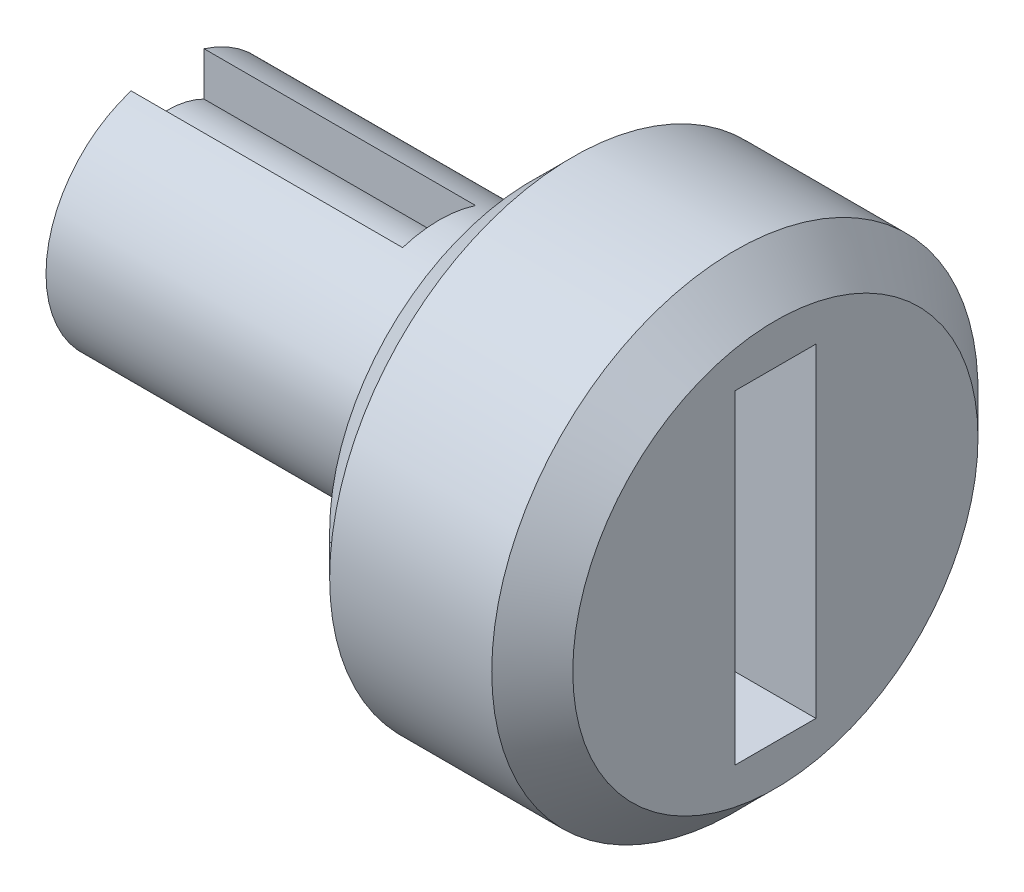
ISO-10303-21;
HEADER;
FILE_DESCRIPTION(('STEP AP214'),'2;1');
FILE_NAME('part.step','',(''),(''),'','','');
FILE_SCHEMA(('AUTOMOTIVE_DESIGN { 1 0 10303 214 1 1 1 1 }'));
ENDSEC;
DATA;
#1=APPLICATION_CONTEXT('core data for automotive mechanical design processes');
#2=APPLICATION_PROTOCOL_DEFINITION('international standard','automotive_design',2000,#1);
#3=PRODUCT_CONTEXT('',#1,'mechanical');
#4=PRODUCT('Part','Part','',(#3));
#5=PRODUCT_RELATED_PRODUCT_CATEGORY('part','',(#4));
#6=PRODUCT_DEFINITION_FORMATION('','',#4);
#7=PRODUCT_DEFINITION_CONTEXT('part definition',#1,'design');
#8=PRODUCT_DEFINITION('design','',#6,#7);
#9=PRODUCT_DEFINITION_SHAPE('','',#8);
#10=(LENGTH_UNIT() NAMED_UNIT(*) SI_UNIT(.MILLI.,.METRE.));
#11=(NAMED_UNIT(*) PLANE_ANGLE_UNIT() SI_UNIT($,.RADIAN.));
#12=(NAMED_UNIT(*) SI_UNIT($,.STERADIAN.) SOLID_ANGLE_UNIT());
#13=UNCERTAINTY_MEASURE_WITH_UNIT(LENGTH_MEASURE(1.E-05),#10,'distance_accuracy_value','');
#14=(GEOMETRIC_REPRESENTATION_CONTEXT(3) GLOBAL_UNCERTAINTY_ASSIGNED_CONTEXT((#13)) GLOBAL_UNIT_ASSIGNED_CONTEXT((#10,
#11,#12)) REPRESENTATION_CONTEXT('',''));
#15=CARTESIAN_POINT('',(0.,0.,0.));
#16=DIRECTION('',(0.,0.,1.));
#17=DIRECTION('',(1.,0.,0.));
#18=AXIS2_PLACEMENT_3D('',#15,#16,#17);
#19=CARTESIAN_POINT('',(0.,0.,0.));
#20=DIRECTION('',(1.,0.,0.));
#21=DIRECTION('',(0.,0.,-1.));
#22=AXIS2_PLACEMENT_3D('',#19,#20,#21);
#23=PLANE('',#22);
#24=CARTESIAN_POINT('',(0.,0.,0.));
#25=DIRECTION('',(-1.,0.,0.));
#26=DIRECTION('',(0.,0.,1.));
#27=AXIS2_PLACEMENT_3D('',#24,#25,#26);
#28=CIRCLE('',#27,1.);
#29=CARTESIAN_POINT('',(0.,0.,1.));
#30=VERTEX_POINT('',#29);
#31=EDGE_CURVE('E216',#30,#30,#28,.T.);
#32=ORIENTED_EDGE('',*,*,#31,.F.);
#33=EDGE_LOOP('',(#32));
#34=FACE_BOUND('',#33,.T.);
#35=CARTESIAN_POINT('',(0.,0.,0.));
#36=DIRECTION('',(1.,0.,0.));
#37=DIRECTION('',(0.,0.,1.));
#38=AXIS2_PLACEMENT_3D('',#35,#36,#37);
#39=CIRCLE('',#38,2.);
#40=CARTESIAN_POINT('',(0.,-1.78605710994917,0.9));
#41=VERTEX_POINT('',#40);
#42=CARTESIAN_POINT('',(0.,-1.78605710994917,-0.9));
#43=VERTEX_POINT('',#42);
#44=EDGE_CURVE('E148',#41,#43,#39,.T.);
#45=ORIENTED_EDGE('',*,*,#44,.F.);
#46=DIRECTION('',(0.,1.,0.));
#47=VECTOR('',#46,1.);
#48=CARTESIAN_POINT('',(0.,-1.78605710994917,0.9));
#49=LINE('',#48,#47);
#50=CARTESIAN_POINT('',(0.,-2.86181760425084,0.9));
#51=VERTEX_POINT('',#50);
#52=EDGE_CURVE('E140',#51,#41,#49,.T.);
#53=ORIENTED_EDGE('',*,*,#52,.F.);
#54=CARTESIAN_POINT('',(0.,0.,0.));
#55=DIRECTION('',(-1.,0.,0.));
#56=DIRECTION('',(0.,0.,1.));
#57=AXIS2_PLACEMENT_3D('',#54,#55,#56);
#58=CIRCLE('',#57,3.);
#59=CARTESIAN_POINT('',(0.,2.86181760425084,0.9));
#60=VERTEX_POINT('',#59);
#61=EDGE_CURVE('E57',#51,#60,#58,.T.);
#62=ORIENTED_EDGE('',*,*,#61,.T.);
#63=DIRECTION('',(0.,1.,0.));
#64=VECTOR('',#63,1.);
#65=CARTESIAN_POINT('',(0.,2.86181760425084,0.9));
#66=LINE('',#65,#64);
#67=CARTESIAN_POINT('',(0.,1.78605710994917,0.9));
#68=VERTEX_POINT('',#67);
#69=EDGE_CURVE('E162',#68,#60,#66,.T.);
#70=ORIENTED_EDGE('',*,*,#69,.F.);
#71=CARTESIAN_POINT('',(0.,0.,0.));
#72=DIRECTION('',(1.,0.,0.));
#73=DIRECTION('',(0.,0.,1.));
#74=AXIS2_PLACEMENT_3D('',#71,#72,#73);
#75=CIRCLE('',#74,2.);
#76=CARTESIAN_POINT('',(0.,1.78605710994917,-0.9));
#77=VERTEX_POINT('',#76);
#78=EDGE_CURVE('E165',#77,#68,#75,.T.);
#79=ORIENTED_EDGE('',*,*,#78,.F.);
#80=DIRECTION('',(0.,-1.,0.));
#81=VECTOR('',#80,1.);
#82=CARTESIAN_POINT('',(0.,2.86181760425084,-0.9));
#83=LINE('',#82,#81);
#84=CARTESIAN_POINT('',(0.,2.86181760425084,-0.9));
#85=VERTEX_POINT('',#84);
#86=EDGE_CURVE('E161',#85,#77,#83,.T.);
#87=ORIENTED_EDGE('',*,*,#86,.F.);
#88=CARTESIAN_POINT('',(0.,-2.86181760425084,-0.9));
#89=VERTEX_POINT('',#88);
#90=EDGE_CURVE('E231',#85,#89,#58,.T.);
#91=ORIENTED_EDGE('',*,*,#90,.T.);
#92=DIRECTION('',(0.,-1.,0.));
#93=VECTOR('',#92,1.);
#94=CARTESIAN_POINT('',(0.,-1.78605710994917,-0.9));
#95=LINE('',#94,#93);
#96=EDGE_CURVE('E49',#43,#89,#95,.T.);
#97=ORIENTED_EDGE('',*,*,#96,.F.);
#98=EDGE_LOOP('',(#45,#53,#62,#70,#79,#87,#91,#97));
#99=FACE_BOUND('',#98,.T.);
#100=ADVANCED_FACE('F34',(#34,#99),#23,.F.);
#101=CARTESIAN_POINT('',(0.,0.,0.));
#102=DIRECTION('',(-1.,0.,0.));
#103=DIRECTION('',(0.,0.,1.));
#104=AXIS2_PLACEMENT_3D('',#101,#102,#103);
#105=CYLINDRICAL_SURFACE('',#104,3.);
#106=ORIENTED_EDGE('',*,*,#61,.F.);
#107=DIRECTION('',(-1.,0.,0.));
#108=VECTOR('',#107,1.);
#109=CARTESIAN_POINT('',(11.171095884641,-2.86181760425084,0.9));
#110=LINE('',#109,#108);
#111=CARTESIAN_POINT('',(6.7,-2.86181760425084,0.9));
#112=VERTEX_POINT('',#111);
#113=EDGE_CURVE('E154',#112,#51,#110,.T.);
#114=ORIENTED_EDGE('',*,*,#113,.F.);
#115=CARTESIAN_POINT('',(6.7,0.,0.));
#116=DIRECTION('',(1.,0.,0.));
#117=DIRECTION('',(0.,0.,-1.));
#118=AXIS2_PLACEMENT_3D('',#115,#116,#117);
#119=CIRCLE('',#118,3.);
#120=CARTESIAN_POINT('',(6.7,-2.86181760425084,-0.9));
#121=VERTEX_POINT('',#120);
#122=EDGE_CURVE('E145',#121,#112,#119,.F.);
#123=ORIENTED_EDGE('',*,*,#122,.F.);
#124=DIRECTION('',(-1.,0.,0.));
#125=VECTOR('',#124,1.);
#126=CARTESIAN_POINT('',(11.171095884641,-2.86181760425084,-0.9));
#127=LINE('',#126,#125);
#128=EDGE_CURVE('E155',#121,#89,#127,.T.);
#129=ORIENTED_EDGE('',*,*,#128,.T.);
#130=ORIENTED_EDGE('',*,*,#90,.F.);
#131=DIRECTION('',(-1.,0.,0.));
#132=VECTOR('',#131,1.);
#133=CARTESIAN_POINT('',(11.171095884641,2.86181760425084,-0.9));
#134=LINE('',#133,#132);
#135=CARTESIAN_POINT('',(6.7,2.86181760425084,-0.9));
#136=VERTEX_POINT('',#135);
#137=EDGE_CURVE('E176',#136,#85,#134,.T.);
#138=ORIENTED_EDGE('',*,*,#137,.F.);
#139=CARTESIAN_POINT('',(6.7,0.,0.));
#140=DIRECTION('',(1.,0.,0.));
#141=DIRECTION('',(0.,0.,-1.));
#142=AXIS2_PLACEMENT_3D('',#139,#140,#141);
#143=CIRCLE('',#142,3.);
#144=CARTESIAN_POINT('',(6.7,2.86181760425084,0.9));
#145=VERTEX_POINT('',#144);
#146=EDGE_CURVE('E173',#145,#136,#143,.F.);
#147=ORIENTED_EDGE('',*,*,#146,.F.);
#148=DIRECTION('',(-1.,0.,0.));
#149=VECTOR('',#148,1.);
#150=CARTESIAN_POINT('',(11.171095884641,2.86181760425084,0.9));
#151=LINE('',#150,#149);
#152=EDGE_CURVE('E177',#145,#60,#151,.T.);
#153=ORIENTED_EDGE('',*,*,#152,.T.);
#154=EDGE_LOOP('',(#106,#114,#123,#129,#130,#138,#147,#153));
#155=FACE_BOUND('',#154,.T.);
#156=CARTESIAN_POINT('',(9.,0.,0.));
#157=DIRECTION('',(-1.,0.,0.));
#158=DIRECTION('',(0.,0.,1.));
#159=AXIS2_PLACEMENT_3D('',#156,#157,#158);
#160=CIRCLE('',#159,3.);
#161=CARTESIAN_POINT('',(9.,0.,3.));
#162=VERTEX_POINT('',#161);
#163=EDGE_CURVE('E228',#162,#162,#160,.T.);
#164=ORIENTED_EDGE('',*,*,#163,.T.);
#165=EDGE_LOOP('',(#164));
#166=FACE_BOUND('',#165,.T.);
#167=ADVANCED_FACE('F265',(#155,#166),#105,.T.);
#168=CARTESIAN_POINT('',(9.,0.,-3.));
#169=DIRECTION('',(1.,0.,0.));
#170=DIRECTION('',(0.,0.,-1.));
#171=AXIS2_PLACEMENT_3D('',#168,#169,#170);
#172=PLANE('',#171);
#173=CARTESIAN_POINT('',(9.,0.,0.));
#174=DIRECTION('',(1.,0.,0.));
#175=DIRECTION('',(0.,0.,-1.));
#176=AXIS2_PLACEMENT_3D('',#173,#174,#175);
#177=CIRCLE('',#176,5.);
#178=CARTESIAN_POINT('',(9.,0.,-5.));
#179=VERTEX_POINT('',#178);
#180=EDGE_CURVE('E13',#179,#179,#177,.F.);
#181=ORIENTED_EDGE('',*,*,#180,.T.);
#182=EDGE_LOOP('',(#181));
#183=FACE_BOUND('',#182,.T.);
#184=ORIENTED_EDGE('',*,*,#163,.F.);
#185=EDGE_LOOP('',(#184));
#186=FACE_BOUND('',#185,.T.);
#187=ADVANCED_FACE('F254',(#183,#186),#172,.F.);
#188=CARTESIAN_POINT('',(0.,0.,0.));
#189=DIRECTION('',(-1.,0.,0.));
#190=DIRECTION('',(0.,0.,1.));
#191=AXIS2_PLACEMENT_3D('',#188,#189,#190);
#192=CYLINDRICAL_SURFACE('',#191,6.);
#193=CARTESIAN_POINT('',(14.,0.,0.));
#194=DIRECTION('',(-1.,0.,0.));
#195=DIRECTION('',(0.,0.,1.));
#196=AXIS2_PLACEMENT_3D('',#193,#194,#195);
#197=CIRCLE('',#196,6.);
#198=CARTESIAN_POINT('',(14.,0.,6.));
#199=VERTEX_POINT('',#198);
#200=EDGE_CURVE('E237',#199,#199,#197,.T.);
#201=ORIENTED_EDGE('',*,*,#200,.T.);
#202=EDGE_LOOP('',(#201));
#203=FACE_BOUND('',#202,.T.);
#204=CARTESIAN_POINT('',(10.,0.,0.));
#205=DIRECTION('',(1.,0.,0.));
#206=DIRECTION('',(0.,0.,-1.));
#207=AXIS2_PLACEMENT_3D('',#204,#205,#206);
#208=CIRCLE('',#207,6.);
#209=CARTESIAN_POINT('',(10.,0.,-6.));
#210=VERTEX_POINT('',#209);
#211=EDGE_CURVE('E234',#210,#210,#208,.T.);
#212=ORIENTED_EDGE('',*,*,#211,.T.);
#213=EDGE_LOOP('',(#212));
#214=FACE_BOUND('',#213,.T.);
#215=ADVANCED_FACE('F251',(#203,#214),#192,.T.);
#216=CARTESIAN_POINT('',(15.,0.,-6.));
#217=DIRECTION('',(-1.,0.,0.));
#218=DIRECTION('',(0.,0.,1.));
#219=AXIS2_PLACEMENT_3D('',#216,#217,#218);
#220=PLANE('',#219);
#221=CARTESIAN_POINT('',(15.,0.,0.));
#222=DIRECTION('',(-1.,0.,0.));
#223=DIRECTION('',(0.,0.,1.));
#224=AXIS2_PLACEMENT_3D('',#221,#222,#223);
#225=CIRCLE('',#224,5.);
#226=CARTESIAN_POINT('',(15.,0.,5.));
#227=VERTEX_POINT('',#226);
#228=EDGE_CURVE('E42',#227,#227,#225,.F.);
#229=ORIENTED_EDGE('',*,*,#228,.T.);
#230=EDGE_LOOP('',(#229));
#231=FACE_BOUND('',#230,.T.);
#232=DIRECTION('',(0.,0.,1.));
#233=VECTOR('',#232,1.);
#234=CARTESIAN_POINT('',(15.,4.,1.));
#235=LINE('',#234,#233);
#236=CARTESIAN_POINT('',(15.,4.,-0.999999999999999));
#237=VERTEX_POINT('',#236);
#238=CARTESIAN_POINT('',(15.,4.,1.));
#239=VERTEX_POINT('',#238);
#240=EDGE_CURVE('E206',#237,#239,#235,.T.);
#241=ORIENTED_EDGE('',*,*,#240,.F.);
#242=DIRECTION('',(0.,1.,0.));
#243=VECTOR('',#242,1.);
#244=CARTESIAN_POINT('',(15.,-4.,-0.999999999999999));
#245=LINE('',#244,#243);
#246=CARTESIAN_POINT('',(15.,-4.,-0.999999999999999));
#247=VERTEX_POINT('',#246);
#248=EDGE_CURVE('E190',#247,#237,#245,.T.);
#249=ORIENTED_EDGE('',*,*,#248,.F.);
#250=DIRECTION('',(0.,0.,-1.));
#251=VECTOR('',#250,1.);
#252=CARTESIAN_POINT('',(15.,-4.,1.));
#253=LINE('',#252,#251);
#254=CARTESIAN_POINT('',(15.,-4.,1.));
#255=VERTEX_POINT('',#254);
#256=EDGE_CURVE('E195',#255,#247,#253,.T.);
#257=ORIENTED_EDGE('',*,*,#256,.F.);
#258=DIRECTION('',(0.,-1.,0.));
#259=VECTOR('',#258,1.);
#260=CARTESIAN_POINT('',(15.,-4.,1.));
#261=LINE('',#260,#259);
#262=EDGE_CURVE('E209',#239,#255,#261,.T.);
#263=ORIENTED_EDGE('',*,*,#262,.F.);
#264=EDGE_LOOP('',(#241,#249,#257,#263));
#265=FACE_BOUND('',#264,.T.);
#266=ADVANCED_FACE('F242',(#231,#265),#220,.F.);
#267=CARTESIAN_POINT('',(9.,0.,-3.));
#268=DIRECTION('',(1.,0.,0.));
#269=DIRECTION('',(0.,0.,-1.));
#270=AXIS2_PLACEMENT_3D('',#267,#268,#269);
#271=PLANE('',#270);
#272=CARTESIAN_POINT('',(9.,0.,0.));
#273=DIRECTION('',(1.,0.,0.));
#274=DIRECTION('',(0.,0.,-1.));
#275=AXIS2_PLACEMENT_3D('',#272,#273,#274);
#276=CIRCLE('',#275,1.);
#277=CARTESIAN_POINT('',(9.,0.,1.));
#278=VERTEX_POINT('',#277);
#279=EDGE_CURVE('E225',#278,#278,#276,.F.);
#280=ORIENTED_EDGE('',*,*,#279,.T.);
#281=EDGE_LOOP('',(#280));
#282=FACE_BOUND('',#281,.T.);
#283=ADVANCED_FACE('F280',(#282),#271,.F.);
#284=CARTESIAN_POINT('',(11.8284271247462,0.,0.));
#285=DIRECTION('',(-1.,0.,0.));
#286=DIRECTION('',(0.,0.,1.));
#287=AXIS2_PLACEMENT_3D('',#284,#285,#286);
#288=CYLINDRICAL_SURFACE('',#287,1.);
#289=CARTESIAN_POINT('',(0.,0.,1.));
#290=CARTESIAN_POINT('',(0.0937500000000001,0.,1.));
#291=CARTESIAN_POINT('',(0.1875,0.,1.));
#292=CARTESIAN_POINT('',(0.375,0.,1.));
#293=CARTESIAN_POINT('',(0.46875,0.,1.));
#294=CARTESIAN_POINT('',(0.656250000000001,0.,1.));
#295=CARTESIAN_POINT('',(0.750000000000001,0.,1.));
#296=CARTESIAN_POINT('',(0.937500000000001,0.,1.));
#297=CARTESIAN_POINT('',(1.03125,0.,1.));
#298=CARTESIAN_POINT('',(1.21875,0.,1.));
#299=CARTESIAN_POINT('',(1.3125,0.,1.));
#300=CARTESIAN_POINT('',(1.5,0.,1.));
#301=CARTESIAN_POINT('',(1.59375,0.,1.));
#302=CARTESIAN_POINT('',(1.78125,0.,1.));
#303=CARTESIAN_POINT('',(1.875,0.,1.));
#304=CARTESIAN_POINT('',(2.0625,0.,1.));
#305=CARTESIAN_POINT('',(2.15625,0.,1.));
#306=CARTESIAN_POINT('',(2.34375,0.,1.));
#307=CARTESIAN_POINT('',(2.4375,0.,1.));
#308=CARTESIAN_POINT('',(2.625,0.,1.));
#309=CARTESIAN_POINT('',(2.71875,0.,1.));
#310=CARTESIAN_POINT('',(2.90625,0.,1.));
#311=CARTESIAN_POINT('',(3.,0.,1.));
#312=CARTESIAN_POINT('',(3.1875,0.,1.));
#313=CARTESIAN_POINT('',(3.28125,0.,1.));
#314=CARTESIAN_POINT('',(3.46875,0.,1.));
#315=CARTESIAN_POINT('',(3.5625,0.,1.));
#316=CARTESIAN_POINT('',(3.75,0.,1.));
#317=CARTESIAN_POINT('',(3.84375,0.,1.));
#318=CARTESIAN_POINT('',(4.03125,0.,1.));
#319=CARTESIAN_POINT('',(4.125,0.,1.));
#320=CARTESIAN_POINT('',(4.3125,0.,1.));
#321=CARTESIAN_POINT('',(4.40625,0.,1.));
#322=CARTESIAN_POINT('',(4.59375,0.,1.));
#323=CARTESIAN_POINT('',(4.6875,0.,1.));
#324=CARTESIAN_POINT('',(4.875,0.,1.));
#325=CARTESIAN_POINT('',(4.96875,0.,1.));
#326=CARTESIAN_POINT('',(5.15625,0.,1.));
#327=CARTESIAN_POINT('',(5.25,0.,1.));
#328=CARTESIAN_POINT('',(5.4375,0.,1.));
#329=CARTESIAN_POINT('',(5.53125,0.,1.));
#330=CARTESIAN_POINT('',(5.71875,0.,1.));
#331=CARTESIAN_POINT('',(5.8125,0.,1.));
#332=CARTESIAN_POINT('',(6.,0.,1.));
#333=CARTESIAN_POINT('',(6.09375,0.,1.));
#334=CARTESIAN_POINT('',(6.28125,0.,1.));
#335=CARTESIAN_POINT('',(6.375,0.,1.));
#336=CARTESIAN_POINT('',(6.5625,0.,1.));
#337=CARTESIAN_POINT('',(6.65625,0.,1.));
#338=CARTESIAN_POINT('',(6.84375,0.,1.));
#339=CARTESIAN_POINT('',(6.9375,0.,1.));
#340=CARTESIAN_POINT('',(7.125,0.,1.));
#341=CARTESIAN_POINT('',(7.21875,0.,1.));
#342=CARTESIAN_POINT('',(7.40625,0.,1.));
#343=CARTESIAN_POINT('',(7.5,0.,1.));
#344=CARTESIAN_POINT('',(7.6875,0.,1.));
#345=CARTESIAN_POINT('',(7.78125,0.,1.));
#346=CARTESIAN_POINT('',(7.96875,0.,1.));
#347=CARTESIAN_POINT('',(8.0625,0.,1.));
#348=CARTESIAN_POINT('',(8.25,0.,1.));
#349=CARTESIAN_POINT('',(8.34375,0.,1.));
#350=CARTESIAN_POINT('',(8.53125,0.,1.));
#351=CARTESIAN_POINT('',(8.625,0.,1.));
#352=CARTESIAN_POINT('',(8.8125,0.,1.));
#353=CARTESIAN_POINT('',(8.90625,0.,1.));
#354=CARTESIAN_POINT('',(9.,0.,1.));
#355=B_SPLINE_CURVE_WITH_KNOTS('',3,(#289,#290,#291,#292,#293,#294,#295,#296,#297,#298,#299,
#300,#301,#302,#303,#304,#305,#306,#307,#308,#309,#310,#311,#312,#313,#314,#315,#316,#317,#318,
#319,#320,#321,#322,#323,#324,#325,#326,#327,#328,#329,#330,#331,#332,#333,#334,#335,#336,#337,
#338,#339,#340,#341,#342,#343,#344,#345,#346,#347,#348,#349,#350,#351,#352,#353,#354),
.UNSPECIFIED.,.F.,.F.,(4,2,2,2,2,2,2,2,2,2,2,2,2,2,2,2,2,2,2,2,2,2,2,2,2,2,2,2,2,2,2,2,4),(0.,
0.28125,0.5625,0.843750000000001,1.125,1.40625,1.6875,1.96875,2.25,2.53125,2.8125,3.09375,3.375,
3.65625,3.9375,4.21875,4.5,4.78125,5.0625,5.34375,5.625,5.90625,6.1875,6.46875,6.75,7.03125,
7.3125,7.59375,7.875,8.15625,8.4375,8.71875,9.),.UNSPECIFIED.);
#356=EDGE_CURVE('BSEAM283',#30,#278,#355,.T.);
#357=ORIENTED_EDGE('',*,*,#31,.T.);
#358=ORIENTED_EDGE('',*,*,#279,.F.);
#359=ORIENTED_EDGE('',*,*,#356,.T.);
#360=ORIENTED_EDGE('',*,*,#356,.F.);
#361=EDGE_LOOP('',(#357,#359,#358,#360));
#362=FACE_BOUND('',#361,.T.);
#363=ADVANCED_FACE('F283',(#362),#288,.F.);
#364=CARTESIAN_POINT('',(11.,-4.,-0.999999999999999));
#365=DIRECTION('',(0.,0.,-1.));
#366=DIRECTION('',(-1.,0.,0.));
#367=AXIS2_PLACEMENT_3D('',#364,#365,#366);
#368=PLANE('',#367);
#369=ORIENTED_EDGE('',*,*,#248,.T.);
#370=DIRECTION('',(1.,0.,0.));
#371=VECTOR('',#370,1.);
#372=CARTESIAN_POINT('',(11.,4.,-0.999999999999999));
#373=LINE('',#372,#371);
#374=CARTESIAN_POINT('',(11.,4.,-0.999999999999999));
#375=VERTEX_POINT('',#374);
#376=EDGE_CURVE('E204',#375,#237,#373,.T.);
#377=ORIENTED_EDGE('',*,*,#376,.F.);
#378=DIRECTION('',(0.,1.,0.));
#379=VECTOR('',#378,1.);
#380=CARTESIAN_POINT('',(11.,-4.,-0.999999999999999));
#381=LINE('',#380,#379);
#382=CARTESIAN_POINT('',(11.,-4.,-0.999999999999999));
#383=VERTEX_POINT('',#382);
#384=EDGE_CURVE('E191',#383,#375,#381,.T.);
#385=ORIENTED_EDGE('',*,*,#384,.F.);
#386=DIRECTION('',(1.,0.,0.));
#387=VECTOR('',#386,1.);
#388=CARTESIAN_POINT('',(11.,-4.,-0.999999999999999));
#389=LINE('',#388,#387);
#390=EDGE_CURVE('E214',#383,#247,#389,.T.);
#391=ORIENTED_EDGE('',*,*,#390,.T.);
#392=EDGE_LOOP('',(#369,#377,#385,#391));
#393=FACE_BOUND('',#392,.T.);
#394=ADVANCED_FACE('F287',(#393),#368,.F.);
#395=CARTESIAN_POINT('',(11.,-4.,1.));
#396=DIRECTION('',(0.,-1.,0.));
#397=DIRECTION('',(0.,0.,-1.));
#398=AXIS2_PLACEMENT_3D('',#395,#396,#397);
#399=PLANE('',#398);
#400=ORIENTED_EDGE('',*,*,#256,.T.);
#401=ORIENTED_EDGE('',*,*,#390,.F.);
#402=DIRECTION('',(0.,0.,-1.));
#403=VECTOR('',#402,1.);
#404=CARTESIAN_POINT('',(11.,-4.,1.));
#405=LINE('',#404,#403);
#406=CARTESIAN_POINT('',(11.,-4.,1.));
#407=VERTEX_POINT('',#406);
#408=EDGE_CURVE('E201',#407,#383,#405,.T.);
#409=ORIENTED_EDGE('',*,*,#408,.F.);
#410=DIRECTION('',(1.,0.,0.));
#411=VECTOR('',#410,1.);
#412=CARTESIAN_POINT('',(11.,-4.,1.));
#413=LINE('',#412,#411);
#414=EDGE_CURVE('E217',#407,#255,#413,.T.);
#415=ORIENTED_EDGE('',*,*,#414,.T.);
#416=EDGE_LOOP('',(#400,#401,#409,#415));
#417=FACE_BOUND('',#416,.T.);
#418=ADVANCED_FACE('F291',(#417),#399,.F.);
#419=CARTESIAN_POINT('',(11.,-4.,1.));
#420=DIRECTION('',(0.,0.,1.));
#421=DIRECTION('',(1.,0.,0.));
#422=AXIS2_PLACEMENT_3D('',#419,#420,#421);
#423=PLANE('',#422);
#424=ORIENTED_EDGE('',*,*,#262,.T.);
#425=ORIENTED_EDGE('',*,*,#414,.F.);
#426=DIRECTION('',(0.,-1.,0.));
#427=VECTOR('',#426,1.);
#428=CARTESIAN_POINT('',(11.,-4.,1.));
#429=LINE('',#428,#427);
#430=CARTESIAN_POINT('',(11.,4.,1.));
#431=VERTEX_POINT('',#430);
#432=EDGE_CURVE('E198',#431,#407,#429,.T.);
#433=ORIENTED_EDGE('',*,*,#432,.F.);
#434=DIRECTION('',(1.,0.,0.));
#435=VECTOR('',#434,1.);
#436=CARTESIAN_POINT('',(11.,4.,1.));
#437=LINE('',#436,#435);
#438=EDGE_CURVE('E219',#431,#239,#437,.T.);
#439=ORIENTED_EDGE('',*,*,#438,.T.);
#440=EDGE_LOOP('',(#424,#425,#433,#439));
#441=FACE_BOUND('',#440,.T.);
#442=ADVANCED_FACE('F296',(#441),#423,.F.);
#443=CARTESIAN_POINT('',(11.,4.,1.));
#444=DIRECTION('',(0.,1.,0.));
#445=DIRECTION('',(0.,0.,1.));
#446=AXIS2_PLACEMENT_3D('',#443,#444,#445);
#447=PLANE('',#446);
#448=ORIENTED_EDGE('',*,*,#240,.T.);
#449=ORIENTED_EDGE('',*,*,#438,.F.);
#450=DIRECTION('',(0.,0.,1.));
#451=VECTOR('',#450,1.);
#452=CARTESIAN_POINT('',(11.,4.,1.));
#453=LINE('',#452,#451);
#454=EDGE_CURVE('E194',#375,#431,#453,.T.);
#455=ORIENTED_EDGE('',*,*,#454,.F.);
#456=ORIENTED_EDGE('',*,*,#376,.T.);
#457=EDGE_LOOP('',(#448,#449,#455,#456));
#458=FACE_BOUND('',#457,.T.);
#459=ADVANCED_FACE('F293',(#458),#447,.F.);
#460=CARTESIAN_POINT('',(11.,4.,-0.999999999999999));
#461=DIRECTION('',(-1.,0.,0.));
#462=DIRECTION('',(0.,0.,1.));
#463=AXIS2_PLACEMENT_3D('',#460,#461,#462);
#464=PLANE('',#463);
#465=ORIENTED_EDGE('',*,*,#384,.T.);
#466=ORIENTED_EDGE('',*,*,#454,.T.);
#467=ORIENTED_EDGE('',*,*,#432,.T.);
#468=ORIENTED_EDGE('',*,*,#408,.T.);
#469=EDGE_LOOP('',(#465,#466,#467,#468));
#470=FACE_BOUND('',#469,.T.);
#471=ADVANCED_FACE('F248',(#470),#464,.F.);
#472=CARTESIAN_POINT('',(14.,0.,0.));
#473=DIRECTION('',(-1.,0.,0.));
#474=DIRECTION('',(0.,0.,1.));
#475=AXIS2_PLACEMENT_3D('',#472,#473,#474);
#476=CONICAL_SURFACE('',#475,6.,0.78539816339745);
#477=ORIENTED_EDGE('',*,*,#228,.F.);
#478=EDGE_LOOP('',(#477));
#479=FACE_BOUND('',#478,.T.);
#480=ORIENTED_EDGE('',*,*,#200,.F.);
#481=EDGE_LOOP('',(#480));
#482=FACE_BOUND('',#481,.T.);
#483=ADVANCED_FACE('F245',(#479,#482),#476,.T.);
#484=CARTESIAN_POINT('',(9.,0.,0.));
#485=DIRECTION('',(1.,0.,0.));
#486=DIRECTION('',(0.,0.,-1.));
#487=AXIS2_PLACEMENT_3D('',#484,#485,#486);
#488=CONICAL_SURFACE('',#487,5.,0.785398163397444);
#489=ORIENTED_EDGE('',*,*,#211,.F.);
#490=EDGE_LOOP('',(#489));
#491=FACE_BOUND('',#490,.T.);
#492=ORIENTED_EDGE('',*,*,#180,.F.);
#493=EDGE_LOOP('',(#492));
#494=FACE_BOUND('',#493,.T.);
#495=ADVANCED_FACE('F36',(#491,#494),#488,.T.);
#496=CARTESIAN_POINT('',(6.7,0.,-3.));
#497=DIRECTION('',(1.,0.,0.));
#498=DIRECTION('',(0.,0.,-1.));
#499=AXIS2_PLACEMENT_3D('',#496,#497,#498);
#500=PLANE('',#499);
#501=ORIENTED_EDGE('',*,*,#146,.T.);
#502=DIRECTION('',(0.,-1.,0.));
#503=VECTOR('',#502,1.);
#504=CARTESIAN_POINT('',(6.7,2.86181760425084,-0.9));
#505=LINE('',#504,#503);
#506=CARTESIAN_POINT('',(6.7,1.78605710994917,-0.9));
#507=VERTEX_POINT('',#506);
#508=EDGE_CURVE('E164',#136,#507,#505,.T.);
#509=ORIENTED_EDGE('',*,*,#508,.T.);
#510=CARTESIAN_POINT('',(6.7,0.,0.));
#511=DIRECTION('',(1.,0.,0.));
#512=DIRECTION('',(0.,0.,-1.));
#513=AXIS2_PLACEMENT_3D('',#510,#511,#512);
#514=CIRCLE('',#513,2.);
#515=CARTESIAN_POINT('',(6.7,1.78605710994917,0.9));
#516=VERTEX_POINT('',#515);
#517=EDGE_CURVE('E182',#507,#516,#514,.T.);
#518=ORIENTED_EDGE('',*,*,#517,.T.);
#519=DIRECTION('',(0.,1.,0.));
#520=VECTOR('',#519,1.);
#521=CARTESIAN_POINT('',(6.7,2.86181760425084,0.9));
#522=LINE('',#521,#520);
#523=EDGE_CURVE('E178',#516,#145,#522,.T.);
#524=ORIENTED_EDGE('',*,*,#523,.T.);
#525=EDGE_LOOP('',(#501,#509,#518,#524));
#526=FACE_BOUND('',#525,.T.);
#527=ADVANCED_FACE('F260',(#526),#500,.F.);
#528=CARTESIAN_POINT('',(11.171095884641,2.86181760425084,-0.9));
#529=DIRECTION('',(0.,0.,-1.));
#530=DIRECTION('',(-1.,0.,0.));
#531=AXIS2_PLACEMENT_3D('',#528,#529,#530);
#532=PLANE('',#531);
#533=ORIENTED_EDGE('',*,*,#137,.T.);
#534=ORIENTED_EDGE('',*,*,#86,.T.);
#535=DIRECTION('',(-1.,0.,0.));
#536=VECTOR('',#535,1.);
#537=CARTESIAN_POINT('',(11.171095884641,1.78605710994917,-0.9));
#538=LINE('',#537,#536);
#539=EDGE_CURVE('E172',#507,#77,#538,.T.);
#540=ORIENTED_EDGE('',*,*,#539,.F.);
#541=ORIENTED_EDGE('',*,*,#508,.F.);
#542=EDGE_LOOP('',(#533,#534,#540,#541));
#543=FACE_BOUND('',#542,.T.);
#544=ADVANCED_FACE('F309',(#543),#532,.F.);
#545=CARTESIAN_POINT('',(11.171095884641,0.,0.));
#546=DIRECTION('',(-1.,0.,0.));
#547=DIRECTION('',(0.,0.,1.));
#548=AXIS2_PLACEMENT_3D('',#545,#546,#547);
#549=CYLINDRICAL_SURFACE('',#548,2.);
#550=ORIENTED_EDGE('',*,*,#539,.T.);
#551=ORIENTED_EDGE('',*,*,#78,.T.);
#552=DIRECTION('',(-1.,0.,0.));
#553=VECTOR('',#552,1.);
#554=CARTESIAN_POINT('',(11.171095884641,1.78605710994917,0.9));
#555=LINE('',#554,#553);
#556=EDGE_CURVE('E181',#516,#68,#555,.T.);
#557=ORIENTED_EDGE('',*,*,#556,.F.);
#558=ORIENTED_EDGE('',*,*,#517,.F.);
#559=EDGE_LOOP('',(#550,#551,#557,#558));
#560=FACE_BOUND('',#559,.T.);
#561=ADVANCED_FACE('F313',(#560),#549,.T.);
#562=CARTESIAN_POINT('',(11.171095884641,2.86181760425084,0.9));
#563=DIRECTION('',(0.,0.,1.));
#564=DIRECTION('',(1.,0.,0.));
#565=AXIS2_PLACEMENT_3D('',#562,#563,#564);
#566=PLANE('',#565);
#567=ORIENTED_EDGE('',*,*,#556,.T.);
#568=ORIENTED_EDGE('',*,*,#69,.T.);
#569=ORIENTED_EDGE('',*,*,#152,.F.);
#570=ORIENTED_EDGE('',*,*,#523,.F.);
#571=EDGE_LOOP('',(#567,#568,#569,#570));
#572=FACE_BOUND('',#571,.T.);
#573=ADVANCED_FACE('F317',(#572),#566,.F.);
#574=CARTESIAN_POINT('',(6.7,0.,-3.));
#575=DIRECTION('',(1.,0.,0.));
#576=DIRECTION('',(0.,0.,-1.));
#577=AXIS2_PLACEMENT_3D('',#574,#575,#576);
#578=PLANE('',#577);
#579=ORIENTED_EDGE('',*,*,#122,.T.);
#580=DIRECTION('',(0.,1.,0.));
#581=VECTOR('',#580,1.);
#582=CARTESIAN_POINT('',(6.7,-1.78605710994917,0.9));
#583=LINE('',#582,#581);
#584=CARTESIAN_POINT('',(6.7,-1.78605710994917,0.9));
#585=VERTEX_POINT('',#584);
#586=EDGE_CURVE('E138',#112,#585,#583,.T.);
#587=ORIENTED_EDGE('',*,*,#586,.T.);
#588=CARTESIAN_POINT('',(6.7,0.,0.));
#589=DIRECTION('',(1.,0.,0.));
#590=DIRECTION('',(0.,0.,-1.));
#591=AXIS2_PLACEMENT_3D('',#588,#589,#590);
#592=CIRCLE('',#591,2.);
#593=CARTESIAN_POINT('',(6.7,-1.78605710994917,-0.9));
#594=VERTEX_POINT('',#593);
#595=EDGE_CURVE('E125',#585,#594,#592,.T.);
#596=ORIENTED_EDGE('',*,*,#595,.T.);
#597=DIRECTION('',(0.,-1.,0.));
#598=VECTOR('',#597,1.);
#599=CARTESIAN_POINT('',(6.7,-1.78605710994917,-0.9));
#600=LINE('',#599,#598);
#601=EDGE_CURVE('E156',#594,#121,#600,.T.);
#602=ORIENTED_EDGE('',*,*,#601,.T.);
#603=EDGE_LOOP('',(#579,#587,#596,#602));
#604=FACE_BOUND('',#603,.T.);
#605=ADVANCED_FACE('F143',(#604),#578,.F.);
#606=CARTESIAN_POINT('',(11.171095884641,-1.78605710994917,0.9));
#607=DIRECTION('',(0.,0.,1.));
#608=DIRECTION('',(0.,-1.,0.));
#609=AXIS2_PLACEMENT_3D('',#606,#607,#608);
#610=PLANE('',#609);
#611=ORIENTED_EDGE('',*,*,#113,.T.);
#612=ORIENTED_EDGE('',*,*,#52,.T.);
#613=DIRECTION('',(-1.,0.,0.));
#614=VECTOR('',#613,1.);
#615=CARTESIAN_POINT('',(11.171095884641,-1.78605710994917,0.9));
#616=LINE('',#615,#614);
#617=EDGE_CURVE('E129',#585,#41,#616,.T.);
#618=ORIENTED_EDGE('',*,*,#617,.F.);
#619=ORIENTED_EDGE('',*,*,#586,.F.);
#620=EDGE_LOOP('',(#611,#612,#618,#619));
#621=FACE_BOUND('',#620,.T.);
#622=ADVANCED_FACE('F137',(#621),#610,.F.);
#623=CARTESIAN_POINT('',(11.171095884641,0.,0.));
#624=DIRECTION('',(-1.,0.,0.));
#625=DIRECTION('',(0.,0.,1.));
#626=AXIS2_PLACEMENT_3D('',#623,#624,#625);
#627=CYLINDRICAL_SURFACE('',#626,2.);
#628=ORIENTED_EDGE('',*,*,#617,.T.);
#629=ORIENTED_EDGE('',*,*,#44,.T.);
#630=DIRECTION('',(-1.,0.,0.));
#631=VECTOR('',#630,1.);
#632=CARTESIAN_POINT('',(11.171095884641,-1.78605710994917,-0.9));
#633=LINE('',#632,#631);
#634=EDGE_CURVE('E131',#594,#43,#633,.T.);
#635=ORIENTED_EDGE('',*,*,#634,.F.);
#636=ORIENTED_EDGE('',*,*,#595,.F.);
#637=EDGE_LOOP('',(#628,#629,#635,#636));
#638=FACE_BOUND('',#637,.T.);
#639=ADVANCED_FACE('F127',(#638),#627,.T.);
#640=CARTESIAN_POINT('',(11.171095884641,-1.78605710994917,-0.9));
#641=DIRECTION('',(0.,0.,-1.));
#642=DIRECTION('',(-1.,0.,0.));
#643=AXIS2_PLACEMENT_3D('',#640,#641,#642);
#644=PLANE('',#643);
#645=ORIENTED_EDGE('',*,*,#634,.T.);
#646=ORIENTED_EDGE('',*,*,#96,.T.);
#647=ORIENTED_EDGE('',*,*,#128,.F.);
#648=ORIENTED_EDGE('',*,*,#601,.F.);
#649=EDGE_LOOP('',(#645,#646,#647,#648));
#650=FACE_BOUND('',#649,.T.);
#651=ADVANCED_FACE('F328',(#650),#644,.F.);
#652=CLOSED_SHELL('',(#100,#167,#187,#215,#266,#283,#363,#394,#418,#442,#459,#471,#483,#495,
#527,#544,#561,#573,#605,#622,#639,#651));
#653=MANIFOLD_SOLID_BREP('B2',#652);
#654=ADVANCED_BREP_SHAPE_REPRESENTATION('',(#18,#653),#14);
#655=SHAPE_DEFINITION_REPRESENTATION(#9,#654);
ENDSEC;
END-ISO-10303-21;
